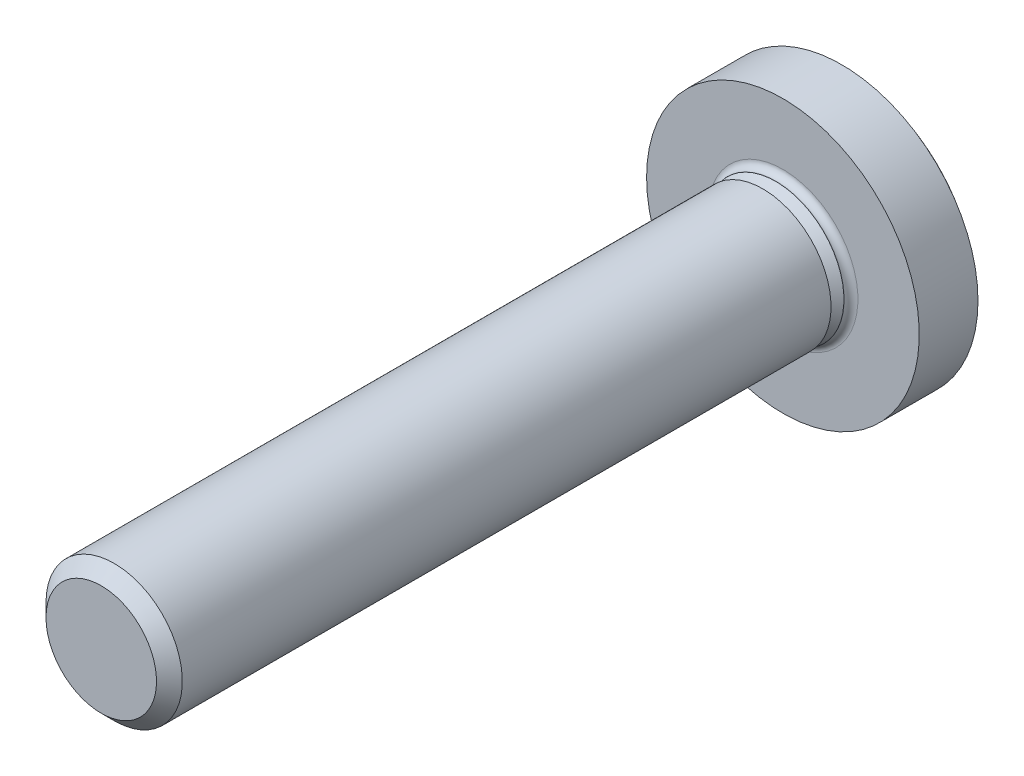
ISO-10303-21;
HEADER;
FILE_DESCRIPTION(('STEP AP214'),'2;1');
FILE_NAME('part.step','',(''),(''),'','','');
FILE_SCHEMA(('AUTOMOTIVE_DESIGN { 1 0 10303 214 1 1 1 1 }'));
ENDSEC;
DATA;
#1=APPLICATION_CONTEXT('core data for automotive mechanical design processes');
#2=APPLICATION_PROTOCOL_DEFINITION('international standard','automotive_design',2000,#1);
#3=PRODUCT_CONTEXT('',#1,'mechanical');
#4=PRODUCT('Part','Part','',(#3));
#5=PRODUCT_RELATED_PRODUCT_CATEGORY('part','',(#4));
#6=PRODUCT_DEFINITION_FORMATION('','',#4);
#7=PRODUCT_DEFINITION_CONTEXT('part definition',#1,'design');
#8=PRODUCT_DEFINITION('design','',#6,#7);
#9=PRODUCT_DEFINITION_SHAPE('','',#8);
#10=(LENGTH_UNIT() NAMED_UNIT(*) SI_UNIT(.MILLI.,.METRE.));
#11=(NAMED_UNIT(*) PLANE_ANGLE_UNIT() SI_UNIT($,.RADIAN.));
#12=(NAMED_UNIT(*) SI_UNIT($,.STERADIAN.) SOLID_ANGLE_UNIT());
#13=UNCERTAINTY_MEASURE_WITH_UNIT(LENGTH_MEASURE(1.E-05),#10,'distance_accuracy_value','');
#14=(GEOMETRIC_REPRESENTATION_CONTEXT(3) GLOBAL_UNCERTAINTY_ASSIGNED_CONTEXT((#13)) GLOBAL_UNIT_ASSIGNED_CONTEXT((#10,
#11,#12)) REPRESENTATION_CONTEXT('',''));
#15=CARTESIAN_POINT('',(0.,0.,0.));
#16=DIRECTION('',(0.,0.,1.));
#17=DIRECTION('',(1.,0.,0.));
#18=AXIS2_PLACEMENT_3D('',#15,#16,#17);
#19=CARTESIAN_POINT('',(0.,0.,6.5));
#20=DIRECTION('',(0.,0.,-1.));
#21=DIRECTION('',(0.,1.,0.));
#22=AXIS2_PLACEMENT_3D('',#19,#20,#21);
#23=SPHERICAL_SURFACE('',#22,6.5);
#24=CARTESIAN_POINT('',(0.,0.,1.3765246170202));
#25=DIRECTION('',(0.,0.,-1.));
#26=DIRECTION('',(-1.,0.,0.));
#27=AXIS2_PLACEMENT_3D('',#24,#25,#26);
#28=CIRCLE('',#27,4.);
#29=CARTESIAN_POINT('',(-4.,0.,1.3765246170202));
#30=VERTEX_POINT('',#29);
#31=EDGE_CURVE('E160',#30,#30,#28,.T.);
#32=ORIENTED_EDGE('',*,*,#31,.T.);
#33=EDGE_LOOP('',(#32));
#34=FACE_BOUND('',#33,.T.);
#35=CARTESIAN_POINT('',(-0.405545392562274,0.189108922281263,6.3801008200685));
#36=DIRECTION('',(-0.875426098065593,0.408217893676735,-0.258819045102521));
#37=DIRECTION('',(-0.422618261740699,-0.90630778703665,0.));
#38=AXIS2_PLACEMENT_3D('',#35,#36,#37);
#39=CIRCLE('',#38,6.48347090197349);
#40=CARTESIAN_POINT('',(0.92299563807694,-0.92299563807694,0.132413478861721));
#41=VERTEX_POINT('',#40);
#42=CARTESIAN_POINT('',(0.305622674506346,-2.10418012593627,0.35760463838069));
#43=VERTEX_POINT('',#42);
#44=EDGE_CURVE('E9',#41,#43,#39,.T.);
#45=ORIENTED_EDGE('',*,*,#44,.F.);
#46=CARTESIAN_POINT('',(-0.189108922281263,0.405545392562274,6.3801008200685));
#47=DIRECTION('',(-0.408217893676735,0.875426098065593,-0.258819045102521));
#48=DIRECTION('',(-0.90630778703665,-0.422618261740699,0.));
#49=AXIS2_PLACEMENT_3D('',#46,#47,#48);
#50=CIRCLE('',#49,6.48347090197349);
#51=CARTESIAN_POINT('',(2.10418012593627,-0.305622674506346,0.357604638380691));
#52=VERTEX_POINT('',#51);
#53=EDGE_CURVE('E24',#52,#41,#50,.T.);
#54=ORIENTED_EDGE('',*,*,#53,.F.);
#55=CARTESIAN_POINT('',(0.427627944162883,0.,6.61458256229943));
#56=DIRECTION('',(-0.965925826289068,0.,-0.258819045102521));
#57=DIRECTION('',(-0.258819045102521,0.,0.965925826289068));
#58=AXIS2_PLACEMENT_3D('',#55,#56,#57);
#59=CIRCLE('',#58,6.48490594980281);
#60=CARTESIAN_POINT('',(2.10418012593627,0.305622674506346,0.357604638380691));
#61=VERTEX_POINT('',#60);
#62=EDGE_CURVE('E224',#61,#52,#59,.T.);
#63=ORIENTED_EDGE('',*,*,#62,.F.);
#64=CARTESIAN_POINT('',(-0.189108922281263,-0.405545392562275,6.3801008200685));
#65=DIRECTION('',(-0.408217893676735,-0.875426098065593,-0.258819045102521));
#66=DIRECTION('',(0.90630778703665,-0.422618261740699,0.));
#67=AXIS2_PLACEMENT_3D('',#64,#65,#66);
#68=CIRCLE('',#67,6.48347090197349);
#69=CARTESIAN_POINT('',(0.922995638076941,0.922995638076939,0.132413478861721));
#70=VERTEX_POINT('',#69);
#71=EDGE_CURVE('E221',#70,#61,#68,.T.);
#72=ORIENTED_EDGE('',*,*,#71,.F.);
#73=CARTESIAN_POINT('',(-0.405545392562273,-0.189108922281263,6.3801008200685));
#74=DIRECTION('',(-0.875426098065593,-0.408217893676735,-0.258819045102521));
#75=DIRECTION('',(0.422618261740699,-0.90630778703665,0.));
#76=AXIS2_PLACEMENT_3D('',#73,#74,#75);
#77=CIRCLE('',#76,6.48347090197349);
#78=CARTESIAN_POINT('',(0.305622674506346,2.10418012593627,0.35760463838069));
#79=VERTEX_POINT('',#78);
#80=EDGE_CURVE('E218',#79,#70,#77,.T.);
#81=ORIENTED_EDGE('',*,*,#80,.F.);
#82=CARTESIAN_POINT('',(0.,0.427627944162883,6.61458256229943));
#83=DIRECTION('',(0.,-0.965925826289068,-0.258819045102521));
#84=DIRECTION('',(0.,0.258819045102521,-0.965925826289068));
#85=AXIS2_PLACEMENT_3D('',#82,#83,#84);
#86=CIRCLE('',#85,6.48490594980281);
#87=CARTESIAN_POINT('',(-0.305622674506345,2.10418012593627,0.35760463838069));
#88=VERTEX_POINT('',#87);
#89=EDGE_CURVE('E215',#88,#79,#86,.T.);
#90=ORIENTED_EDGE('',*,*,#89,.F.);
#91=CARTESIAN_POINT('',(0.405545392562275,-0.189108922281263,6.3801008200685));
#92=DIRECTION('',(0.875426098065593,-0.408217893676735,-0.258819045102521));
#93=DIRECTION('',(0.422618261740699,0.90630778703665,0.));
#94=AXIS2_PLACEMENT_3D('',#91,#92,#93);
#95=CIRCLE('',#94,6.48347090197349);
#96=CARTESIAN_POINT('',(-0.92299563807694,0.922995638076941,0.132413478861721));
#97=VERTEX_POINT('',#96);
#98=EDGE_CURVE('E212',#97,#88,#95,.T.);
#99=ORIENTED_EDGE('',*,*,#98,.F.);
#100=CARTESIAN_POINT('',(0.189108922281263,-0.405545392562273,6.3801008200685));
#101=DIRECTION('',(0.408217893676735,-0.875426098065593,-0.258819045102521));
#102=DIRECTION('',(0.90630778703665,0.422618261740699,0.));
#103=AXIS2_PLACEMENT_3D('',#100,#101,#102);
#104=CIRCLE('',#103,6.48347090197349);
#105=CARTESIAN_POINT('',(-2.10418012593627,0.305622674506346,0.35760463838069));
#106=VERTEX_POINT('',#105);
#107=EDGE_CURVE('E209',#106,#97,#104,.T.);
#108=ORIENTED_EDGE('',*,*,#107,.F.);
#109=CARTESIAN_POINT('',(-0.427627944162883,0.,6.61458256229943));
#110=DIRECTION('',(0.965925826289068,0.,-0.258819045102521));
#111=DIRECTION('',(-0.258819045102521,0.,-0.965925826289068));
#112=AXIS2_PLACEMENT_3D('',#109,#110,#111);
#113=CIRCLE('',#112,6.48490594980281);
#114=CARTESIAN_POINT('',(-2.10418012593627,-0.305622674506345,0.357604638380691));
#115=VERTEX_POINT('',#114);
#116=EDGE_CURVE('E206',#115,#106,#113,.T.);
#117=ORIENTED_EDGE('',*,*,#116,.F.);
#118=CARTESIAN_POINT('',(0.189108922281264,0.405545392562274,6.3801008200685));
#119=DIRECTION('',(0.408217893676735,0.875426098065593,-0.258819045102521));
#120=DIRECTION('',(-0.90630778703665,0.422618261740699,0.));
#121=AXIS2_PLACEMENT_3D('',#118,#119,#120);
#122=CIRCLE('',#121,6.48347090197349);
#123=CARTESIAN_POINT('',(-0.922995638076941,-0.92299563807694,0.132413478861721));
#124=VERTEX_POINT('',#123);
#125=EDGE_CURVE('E203',#124,#115,#122,.T.);
#126=ORIENTED_EDGE('',*,*,#125,.F.);
#127=CARTESIAN_POINT('',(0.405545392562273,0.189108922281263,6.3801008200685));
#128=DIRECTION('',(0.875426098065593,0.408217893676735,-0.258819045102521));
#129=DIRECTION('',(-0.422618261740699,0.90630778703665,0.));
#130=AXIS2_PLACEMENT_3D('',#127,#128,#129);
#131=CIRCLE('',#130,6.48347090197349);
#132=CARTESIAN_POINT('',(-0.305622674506346,-2.10418012593627,0.357604638380691));
#133=VERTEX_POINT('',#132);
#134=EDGE_CURVE('E200',#133,#124,#131,.T.);
#135=ORIENTED_EDGE('',*,*,#134,.F.);
#136=CARTESIAN_POINT('',(0.,-0.427627944162883,6.61458256229943));
#137=DIRECTION('',(0.,0.965925826289068,-0.258819045102521));
#138=DIRECTION('',(0.,0.258819045102521,0.965925826289068));
#139=AXIS2_PLACEMENT_3D('',#136,#137,#138);
#140=CIRCLE('',#139,6.48490594980281);
#141=EDGE_CURVE('E197',#43,#133,#140,.T.);
#142=ORIENTED_EDGE('',*,*,#141,.F.);
#143=EDGE_LOOP('',(#45,#54,#63,#72,#81,#90,#99,#108,#117,#126,#135,#142));
#144=FACE_BOUND('',#143,.T.);
#145=ADVANCED_FACE('F15',(#34,#144),#23,.T.);
#146=CARTESIAN_POINT('',(0.,0.,23.1));
#147=DIRECTION('',(0.,0.,-1.));
#148=DIRECTION('',(-1.,0.,0.));
#149=AXIS2_PLACEMENT_3D('',#146,#147,#148);
#150=PLANE('',#149);
#151=CARTESIAN_POINT('',(0.,0.,23.1));
#152=DIRECTION('',(0.,0.,-1.));
#153=DIRECTION('',(-1.,0.,0.));
#154=AXIS2_PLACEMENT_3D('',#151,#152,#153);
#155=CIRCLE('',#154,1.621125);
#156=CARTESIAN_POINT('',(-1.621125,0.,23.1));
#157=VERTEX_POINT('',#156);
#158=EDGE_CURVE('E193',#157,#157,#155,.T.);
#159=ORIENTED_EDGE('',*,*,#158,.F.);
#160=EDGE_LOOP('',(#159));
#161=FACE_BOUND('',#160,.T.);
#162=ADVANCED_FACE('F17',(#161),#150,.F.);
#163=CARTESIAN_POINT('',(0.,0.,23.1));
#164=DIRECTION('',(0.,0.,-1.));
#165=DIRECTION('',(-1.,0.,0.));
#166=AXIS2_PLACEMENT_3D('',#163,#164,#165);
#167=CONICAL_SURFACE('',#166,1.621125,0.785398163397448);
#168=CARTESIAN_POINT('',(0.,0.,22.721125));
#169=DIRECTION('',(0.,0.,-1.));
#170=DIRECTION('',(-1.,0.,0.));
#171=AXIS2_PLACEMENT_3D('',#168,#169,#170);
#172=CIRCLE('',#171,2.);
#173=CARTESIAN_POINT('',(-2.,0.,22.721125));
#174=VERTEX_POINT('',#173);
#175=EDGE_CURVE('E189',#174,#174,#172,.T.);
#176=ORIENTED_EDGE('',*,*,#175,.F.);
#177=EDGE_LOOP('',(#176));
#178=FACE_BOUND('',#177,.T.);
#179=ORIENTED_EDGE('',*,*,#158,.T.);
#180=EDGE_LOOP('',(#179));
#181=FACE_BOUND('',#180,.T.);
#182=ADVANCED_FACE('F245',(#178,#181),#167,.T.);
#183=CARTESIAN_POINT('',(0.,0.,0.));
#184=DIRECTION('',(0.,0.,-1.));
#185=DIRECTION('',(-1.,0.,0.));
#186=AXIS2_PLACEMENT_3D('',#183,#184,#185);
#187=CYLINDRICAL_SURFACE('',#186,2.);
#188=CARTESIAN_POINT('',(0.,0.,3.688875));
#189=DIRECTION('',(0.,0.,-1.));
#190=DIRECTION('',(-1.,0.,0.));
#191=AXIS2_PLACEMENT_3D('',#188,#189,#190);
#192=CIRCLE('',#191,2.);
#193=CARTESIAN_POINT('',(-2.,0.,3.688875));
#194=VERTEX_POINT('',#193);
#195=EDGE_CURVE('E185',#194,#194,#192,.T.);
#196=ORIENTED_EDGE('',*,*,#195,.F.);
#197=EDGE_LOOP('',(#196));
#198=FACE_BOUND('',#197,.T.);
#199=ORIENTED_EDGE('',*,*,#175,.T.);
#200=EDGE_LOOP('',(#199));
#201=FACE_BOUND('',#200,.T.);
#202=ADVANCED_FACE('F256',(#198,#201),#187,.T.);
#203=CARTESIAN_POINT('',(0.,2.,3.688875));
#204=DIRECTION('',(0.,0.,1.));
#205=DIRECTION('',(1.,0.,0.));
#206=AXIS2_PLACEMENT_3D('',#203,#204,#205);
#207=PLANE('',#206);
#208=CARTESIAN_POINT('',(0.,0.,3.688875));
#209=DIRECTION('',(0.,0.,-1.));
#210=DIRECTION('',(-1.,0.,0.));
#211=AXIS2_PLACEMENT_3D('',#208,#209,#210);
#212=CIRCLE('',#211,1.621125);
#213=CARTESIAN_POINT('',(-1.621125,0.,3.688875));
#214=VERTEX_POINT('',#213);
#215=EDGE_CURVE('E181',#214,#214,#212,.T.);
#216=ORIENTED_EDGE('',*,*,#215,.F.);
#217=EDGE_LOOP('',(#216));
#218=FACE_BOUND('',#217,.T.);
#219=ORIENTED_EDGE('',*,*,#195,.T.);
#220=EDGE_LOOP('',(#219));
#221=FACE_BOUND('',#220,.T.);
#222=ADVANCED_FACE('F265',(#218,#221),#207,.F.);
#223=CARTESIAN_POINT('',(0.,0.,3.688875));
#224=DIRECTION('',(0.,0.,-1.));
#225=DIRECTION('',(-1.,0.,0.));
#226=AXIS2_PLACEMENT_3D('',#223,#224,#225);
#227=CONICAL_SURFACE('',#226,1.621125,0.785398163397449);
#228=CARTESIAN_POINT('',(0.,0.,3.31));
#229=DIRECTION('',(0.,0.,-1.));
#230=DIRECTION('',(-1.,0.,0.));
#231=AXIS2_PLACEMENT_3D('',#228,#229,#230);
#232=CIRCLE('',#231,2.);
#233=CARTESIAN_POINT('',(-2.,0.,3.31));
#234=VERTEX_POINT('',#233);
#235=EDGE_CURVE('E177',#234,#234,#232,.T.);
#236=ORIENTED_EDGE('',*,*,#235,.F.);
#237=EDGE_LOOP('',(#236));
#238=FACE_BOUND('',#237,.T.);
#239=ORIENTED_EDGE('',*,*,#215,.T.);
#240=EDGE_LOOP('',(#239));
#241=FACE_BOUND('',#240,.T.);
#242=ADVANCED_FACE('F275',(#238,#241),#227,.T.);
#243=CARTESIAN_POINT('',(0.,0.,0.));
#244=DIRECTION('',(0.,0.,-1.));
#245=DIRECTION('',(-1.,0.,0.));
#246=AXIS2_PLACEMENT_3D('',#243,#244,#245);
#247=CYLINDRICAL_SURFACE('',#246,2.);
#248=CARTESIAN_POINT('',(0.,0.,3.3));
#249=DIRECTION('',(0.,0.,-1.));
#250=DIRECTION('',(-1.,0.,0.));
#251=AXIS2_PLACEMENT_3D('',#248,#249,#250);
#252=CIRCLE('',#251,2.);
#253=CARTESIAN_POINT('',(-2.,0.,3.3));
#254=VERTEX_POINT('',#253);
#255=EDGE_CURVE('E173',#254,#254,#252,.T.);
#256=ORIENTED_EDGE('',*,*,#255,.F.);
#257=EDGE_LOOP('',(#256));
#258=FACE_BOUND('',#257,.T.);
#259=ORIENTED_EDGE('',*,*,#235,.T.);
#260=EDGE_LOOP('',(#259));
#261=FACE_BOUND('',#260,.T.);
#262=ADVANCED_FACE('F285',(#258,#261),#247,.T.);
#263=CARTESIAN_POINT('',(0.,0.,3.3));
#264=DIRECTION('',(0.,0.,-1.));
#265=DIRECTION('',(-1.,0.,0.));
#266=AXIS2_PLACEMENT_3D('',#263,#264,#265);
#267=TOROIDAL_SURFACE('',#266,2.2,0.2);
#268=ORIENTED_EDGE('',*,*,#255,.T.);
#269=EDGE_LOOP('',(#268));
#270=FACE_BOUND('',#269,.T.);
#271=CARTESIAN_POINT('',(0.,0.,3.1));
#272=DIRECTION('',(0.,0.,-1.));
#273=DIRECTION('',(-1.,0.,0.));
#274=AXIS2_PLACEMENT_3D('',#271,#272,#273);
#275=CIRCLE('',#274,2.2);
#276=CARTESIAN_POINT('',(-2.2,0.,3.1));
#277=VERTEX_POINT('',#276);
#278=EDGE_CURVE('E169',#277,#277,#275,.T.);
#279=ORIENTED_EDGE('',*,*,#278,.F.);
#280=EDGE_LOOP('',(#279));
#281=FACE_BOUND('',#280,.T.);
#282=ADVANCED_FACE('F295',(#270,#281),#267,.F.);
#283=CARTESIAN_POINT('',(0.,2.2,3.1));
#284=DIRECTION('',(0.,0.,-1.));
#285=DIRECTION('',(-1.,0.,0.));
#286=AXIS2_PLACEMENT_3D('',#283,#284,#285);
#287=PLANE('',#286);
#288=CARTESIAN_POINT('',(0.,0.,3.1));
#289=DIRECTION('',(0.,0.,-1.));
#290=DIRECTION('',(-1.,0.,0.));
#291=AXIS2_PLACEMENT_3D('',#288,#289,#290);
#292=CIRCLE('',#291,4.);
#293=CARTESIAN_POINT('',(-4.,0.,3.1));
#294=VERTEX_POINT('',#293);
#295=EDGE_CURVE('E164',#294,#294,#292,.T.);
#296=ORIENTED_EDGE('',*,*,#295,.F.);
#297=EDGE_LOOP('',(#296));
#298=FACE_BOUND('',#297,.T.);
#299=ORIENTED_EDGE('',*,*,#278,.T.);
#300=EDGE_LOOP('',(#299));
#301=FACE_BOUND('',#300,.T.);
#302=ADVANCED_FACE('F305',(#298,#301),#287,.F.);
#303=CARTESIAN_POINT('',(0.,0.,0.));
#304=DIRECTION('',(0.,0.,-1.));
#305=DIRECTION('',(-1.,0.,0.));
#306=AXIS2_PLACEMENT_3D('',#303,#304,#305);
#307=CYLINDRICAL_SURFACE('',#306,4.);
#308=ORIENTED_EDGE('',*,*,#31,.F.);
#309=EDGE_LOOP('',(#308));
#310=FACE_BOUND('',#309,.T.);
#311=ORIENTED_EDGE('',*,*,#295,.T.);
#312=EDGE_LOOP('',(#311));
#313=FACE_BOUND('',#312,.T.);
#314=ADVANCED_FACE('F315',(#310,#313),#307,.T.);
#315=CARTESIAN_POINT('',(0.366666666666667,-2.2,0.));
#316=DIRECTION('',(-0.875426098065593,0.408217893676735,-0.258819045102521));
#317=DIRECTION('',(-0.422618261740699,-0.90630778703665,0.));
#318=AXIS2_PLACEMENT_3D('',#315,#316,#317);
#319=PLANE('',#318);
#320=ORIENTED_EDGE('',*,*,#44,.T.);
#321=DIRECTION('',(0.162689201767992,-0.255370893567974,-0.953057149569945));
#322=VECTOR('',#321,1.);
#323=CARTESIAN_POINT('',(0.366666666666667,-2.2,0.));
#324=LINE('',#323,#322);
#325=CARTESIAN_POINT('',(0.0423319890466869,-1.69089653438087,1.9));
#326=VERTEX_POINT('',#325);
#327=EDGE_CURVE('E31',#326,#43,#324,.T.);
#328=ORIENTED_EDGE('',*,*,#327,.F.);
#329=DIRECTION('',(0.422618261740699,0.90630778703665,0.));
#330=VECTOR('',#329,1.);
#331=CARTESIAN_POINT('',(0.149047069992156,-1.46204530477057,1.9));
#332=LINE('',#331,#330);
#333=CARTESIAN_POINT('',(0.566600049829658,-0.566600049829659,1.9));
#334=VERTEX_POINT('',#333);
#335=EDGE_CURVE('E117',#326,#334,#332,.T.);
#336=ORIENTED_EDGE('',*,*,#335,.T.);
#337=DIRECTION('',(0.193899607686987,-0.193899607686987,-0.961668281829896));
#338=VECTOR('',#337,1.);
#339=CARTESIAN_POINT('',(0.974781670177971,-0.974781670177972,-0.12442553751102));
#340=LINE('',#339,#338);
#341=EDGE_CURVE('E165',#334,#41,#340,.T.);
#342=ORIENTED_EDGE('',*,*,#341,.T.);
#343=EDGE_LOOP('',(#320,#328,#336,#342));
#344=FACE_BOUND('',#343,.T.);
#345=ADVANCED_FACE('F116',(#344),#319,.T.);
#346=CARTESIAN_POINT('',(0.949693951922647,-0.949693951922649,0.));
#347=DIRECTION('',(-0.408217893676735,0.875426098065593,-0.258819045102521));
#348=DIRECTION('',(-0.90630778703665,-0.422618261740699,0.));
#349=AXIS2_PLACEMENT_3D('',#346,#347,#348);
#350=PLANE('',#349);
#351=ORIENTED_EDGE('',*,*,#53,.T.);
#352=ORIENTED_EDGE('',*,*,#341,.F.);
#353=DIRECTION('',(0.90630778703665,0.422618261740699,0.));
#354=VECTOR('',#353,1.);
#355=CARTESIAN_POINT('',(0.177234242228863,-0.748164307737616,1.9));
#356=LINE('',#355,#354);
#357=CARTESIAN_POINT('',(1.69089653438087,-0.0423319890466872,1.9));
#358=VERTEX_POINT('',#357);
#359=EDGE_CURVE('E124',#334,#358,#356,.T.);
#360=ORIENTED_EDGE('',*,*,#359,.T.);
#361=DIRECTION('',(0.255370893567974,-0.162689201767992,-0.953057149569945));
#362=VECTOR('',#361,1.);
#363=CARTESIAN_POINT('',(2.2,-0.366666666666667,0.));
#364=LINE('',#363,#362);
#365=EDGE_CURVE('E506',#358,#52,#364,.T.);
#366=ORIENTED_EDGE('',*,*,#365,.T.);
#367=EDGE_LOOP('',(#351,#352,#360,#366));
#368=FACE_BOUND('',#367,.T.);
#369=ADVANCED_FACE('F333',(#368),#350,.T.);
#370=CARTESIAN_POINT('',(2.2,-0.366666666666667,0.));
#371=DIRECTION('',(-0.965925826289068,0.,-0.258819045102521));
#372=DIRECTION('',(-0.258819045102521,0.,0.965925826289068));
#373=AXIS2_PLACEMENT_3D('',#370,#371,#372);
#374=PLANE('',#373);
#375=ORIENTED_EDGE('',*,*,#62,.T.);
#376=ORIENTED_EDGE('',*,*,#365,.F.);
#377=DIRECTION('',(0.,1.,0.));
#378=VECTOR('',#377,1.);
#379=CARTESIAN_POINT('',(1.69089653438087,-1.67720172645669,1.9));
#380=LINE('',#379,#378);
#381=CARTESIAN_POINT('',(1.69089653438087,0.0423319890466869,1.9));
#382=VERTEX_POINT('',#381);
#383=EDGE_CURVE('E131',#358,#382,#380,.T.);
#384=ORIENTED_EDGE('',*,*,#383,.T.);
#385=DIRECTION('',(0.255370893567974,0.162689201767992,-0.953057149569945));
#386=VECTOR('',#385,1.);
#387=CARTESIAN_POINT('',(2.2,0.366666666666667,0.));
#388=LINE('',#387,#386);
#389=EDGE_CURVE('E503',#382,#61,#388,.T.);
#390=ORIENTED_EDGE('',*,*,#389,.T.);
#391=EDGE_LOOP('',(#375,#376,#384,#390));
#392=FACE_BOUND('',#391,.T.);
#393=ADVANCED_FACE('F348',(#392),#374,.T.);
#394=CARTESIAN_POINT('',(2.2,0.366666666666667,0.));
#395=DIRECTION('',(-0.408217893676735,-0.875426098065593,-0.258819045102521));
#396=DIRECTION('',(0.90630778703665,-0.422618261740699,0.));
#397=AXIS2_PLACEMENT_3D('',#394,#395,#396);
#398=PLANE('',#397);
#399=ORIENTED_EDGE('',*,*,#71,.T.);
#400=ORIENTED_EDGE('',*,*,#389,.F.);
#401=DIRECTION('',(-0.90630778703665,0.422618261740699,0.));
#402=VECTOR('',#401,1.);
#403=CARTESIAN_POINT('',(1.46204530477057,0.149047069992157,1.9));
#404=LINE('',#403,#402);
#405=CARTESIAN_POINT('',(0.566600049829659,0.566600049829658,1.9));
#406=VERTEX_POINT('',#405);
#407=EDGE_CURVE('E137',#382,#406,#404,.T.);
#408=ORIENTED_EDGE('',*,*,#407,.T.);
#409=DIRECTION('',(0.193899607686987,0.193899607686987,-0.961668281829896));
#410=VECTOR('',#409,1.);
#411=CARTESIAN_POINT('',(0.974781670177972,0.97478167017797,-0.12442553751102));
#412=LINE('',#411,#410);
#413=EDGE_CURVE('E500',#406,#70,#412,.T.);
#414=ORIENTED_EDGE('',*,*,#413,.T.);
#415=EDGE_LOOP('',(#399,#400,#408,#414));
#416=FACE_BOUND('',#415,.T.);
#417=ADVANCED_FACE('F357',(#416),#398,.T.);
#418=CARTESIAN_POINT('',(0.949693951922649,0.949693951922647,0.));
#419=DIRECTION('',(-0.875426098065593,-0.408217893676735,-0.258819045102521));
#420=DIRECTION('',(0.422618261740699,-0.90630778703665,0.));
#421=AXIS2_PLACEMENT_3D('',#418,#419,#420);
#422=PLANE('',#421);
#423=ORIENTED_EDGE('',*,*,#80,.T.);
#424=ORIENTED_EDGE('',*,*,#413,.F.);
#425=DIRECTION('',(-0.422618261740699,0.90630778703665,0.));
#426=VECTOR('',#425,1.);
#427=CARTESIAN_POINT('',(1.43385813253386,-1.29324091039736,1.9));
#428=LINE('',#427,#426);
#429=CARTESIAN_POINT('',(0.0423319890466871,1.69089653438087,1.9));
#430=VERTEX_POINT('',#429);
#431=EDGE_CURVE('E140',#406,#430,#428,.T.);
#432=ORIENTED_EDGE('',*,*,#431,.T.);
#433=DIRECTION('',(0.162689201767992,0.255370893567974,-0.953057149569945));
#434=VECTOR('',#433,1.);
#435=CARTESIAN_POINT('',(0.366666666666667,2.2,0.));
#436=LINE('',#435,#434);
#437=EDGE_CURVE('E497',#430,#79,#436,.T.);
#438=ORIENTED_EDGE('',*,*,#437,.T.);
#439=EDGE_LOOP('',(#423,#424,#432,#438));
#440=FACE_BOUND('',#439,.T.);
#441=ADVANCED_FACE('F368',(#440),#422,.T.);
#442=CARTESIAN_POINT('',(0.366666666666667,2.2,0.));
#443=DIRECTION('',(0.,-0.965925826289068,-0.258819045102521));
#444=DIRECTION('',(0.,0.258819045102521,-0.965925826289068));
#445=AXIS2_PLACEMENT_3D('',#442,#443,#444);
#446=PLANE('',#445);
#447=ORIENTED_EDGE('',*,*,#89,.T.);
#448=ORIENTED_EDGE('',*,*,#437,.F.);
#449=DIRECTION('',(-1.,0.,0.));
#450=VECTOR('',#449,1.);
#451=CARTESIAN_POINT('',(0.610451505290122,1.69089653438087,1.9));
#452=LINE('',#451,#450);
#453=CARTESIAN_POINT('',(-0.0423319890466866,1.69089653438087,1.9));
#454=VERTEX_POINT('',#453);
#455=EDGE_CURVE('E143',#430,#454,#452,.T.);
#456=ORIENTED_EDGE('',*,*,#455,.T.);
#457=DIRECTION('',(-0.162689201767992,0.255370893567974,-0.953057149569945));
#458=VECTOR('',#457,1.);
#459=CARTESIAN_POINT('',(-0.366666666666667,2.2,0.));
#460=LINE('',#459,#458);
#461=EDGE_CURVE('E494',#454,#88,#460,.T.);
#462=ORIENTED_EDGE('',*,*,#461,.T.);
#463=EDGE_LOOP('',(#447,#448,#456,#462));
#464=FACE_BOUND('',#463,.T.);
#465=ADVANCED_FACE('F379',(#464),#446,.T.);
#466=CARTESIAN_POINT('',(-0.366666666666667,2.2,0.));
#467=DIRECTION('',(0.875426098065593,-0.408217893676735,-0.258819045102521));
#468=DIRECTION('',(0.422618261740699,0.90630778703665,0.));
#469=AXIS2_PLACEMENT_3D('',#466,#467,#468);
#470=PLANE('',#469);
#471=ORIENTED_EDGE('',*,*,#98,.T.);
#472=ORIENTED_EDGE('',*,*,#461,.F.);
#473=DIRECTION('',(-0.422618261740699,-0.90630778703665,0.));
#474=VECTOR('',#473,1.);
#475=CARTESIAN_POINT('',(-1.21579729115873,-0.825607926976247,1.9));
#476=LINE('',#475,#474);
#477=CARTESIAN_POINT('',(-0.566600049829658,0.56660004982966,1.9));
#478=VERTEX_POINT('',#477);
#479=EDGE_CURVE('E146',#454,#478,#476,.T.);
#480=ORIENTED_EDGE('',*,*,#479,.T.);
#481=DIRECTION('',(-0.193899607686987,0.193899607686987,-0.961668281829896));
#482=VECTOR('',#481,1.);
#483=CARTESIAN_POINT('',(-0.97478167017797,0.974781670177972,-0.12442553751102));
#484=LINE('',#483,#482);
#485=EDGE_CURVE('E491',#478,#97,#484,.T.);
#486=ORIENTED_EDGE('',*,*,#485,.T.);
#487=EDGE_LOOP('',(#471,#472,#480,#486));
#488=FACE_BOUND('',#487,.T.);
#489=ADVANCED_FACE('F390',(#488),#470,.T.);
#490=CARTESIAN_POINT('',(-0.949693951922647,0.949693951922649,0.));
#491=DIRECTION('',(0.408217893676735,-0.875426098065593,-0.258819045102521));
#492=DIRECTION('',(0.90630778703665,0.422618261740699,0.));
#493=AXIS2_PLACEMENT_3D('',#490,#491,#492);
#494=PLANE('',#493);
#495=ORIENTED_EDGE('',*,*,#107,.T.);
#496=ORIENTED_EDGE('',*,*,#485,.F.);
#497=DIRECTION('',(-0.90630778703665,-0.422618261740699,0.));
#498=VECTOR('',#497,1.);
#499=CARTESIAN_POINT('',(-0.459203135565461,0.616680053413271,1.9));
#500=LINE('',#499,#498);
#501=CARTESIAN_POINT('',(-1.69089653438087,0.0423319890466875,1.9));
#502=VERTEX_POINT('',#501);
#503=EDGE_CURVE('E149',#478,#502,#500,.T.);
#504=ORIENTED_EDGE('',*,*,#503,.T.);
#505=DIRECTION('',(-0.255370893567974,0.162689201767992,-0.953057149569945));
#506=VECTOR('',#505,1.);
#507=CARTESIAN_POINT('',(-2.2,0.366666666666668,0.));
#508=LINE('',#507,#506);
#509=EDGE_CURVE('E488',#502,#106,#508,.T.);
#510=ORIENTED_EDGE('',*,*,#509,.T.);
#511=EDGE_LOOP('',(#495,#496,#504,#510));
#512=FACE_BOUND('',#511,.T.);
#513=ADVANCED_FACE('F401',(#512),#494,.T.);
#514=CARTESIAN_POINT('',(-2.2,0.366666666666668,0.));
#515=DIRECTION('',(0.965925826289068,0.,-0.258819045102521));
#516=DIRECTION('',(-0.258819045102521,0.,-0.965925826289068));
#517=AXIS2_PLACEMENT_3D('',#514,#515,#516);
#518=PLANE('',#517);
#519=ORIENTED_EDGE('',*,*,#116,.T.);
#520=ORIENTED_EDGE('',*,*,#509,.F.);
#521=DIRECTION('',(0.,-1.,0.));
#522=VECTOR('',#521,1.);
#523=CARTESIAN_POINT('',(-1.69089653438087,-1.67720172645669,1.9));
#524=LINE('',#523,#522);
#525=CARTESIAN_POINT('',(-1.69089653438087,-0.0423319890466864,1.9));
#526=VERTEX_POINT('',#525);
#527=EDGE_CURVE('E152',#502,#526,#524,.T.);
#528=ORIENTED_EDGE('',*,*,#527,.T.);
#529=DIRECTION('',(-0.255370893567974,-0.162689201767992,-0.953057149569945));
#530=VECTOR('',#529,1.);
#531=CARTESIAN_POINT('',(-2.2,-0.366666666666667,0.));
#532=LINE('',#531,#530);
#533=EDGE_CURVE('E483',#526,#115,#532,.T.);
#534=ORIENTED_EDGE('',*,*,#533,.T.);
#535=EDGE_LOOP('',(#519,#520,#528,#534));
#536=FACE_BOUND('',#535,.T.);
#537=ADVANCED_FACE('F412',(#536),#518,.T.);
#538=CARTESIAN_POINT('',(-2.2,-0.366666666666667,0.));
#539=DIRECTION('',(0.408217893676735,0.875426098065593,-0.258819045102521));
#540=DIRECTION('',(-0.90630778703665,0.422618261740699,0.));
#541=AXIS2_PLACEMENT_3D('',#538,#539,#540);
#542=PLANE('',#541);
#543=ORIENTED_EDGE('',*,*,#125,.T.);
#544=ORIENTED_EDGE('',*,*,#533,.F.);
#545=DIRECTION('',(0.90630778703665,-0.422618261740699,0.));
#546=VECTOR('',#545,1.);
#547=CARTESIAN_POINT('',(0.825607926976246,-1.21579729115873,1.9));
#548=LINE('',#547,#546);
#549=CARTESIAN_POINT('',(-0.56660004982966,-0.566600049829658,1.9));
#550=VERTEX_POINT('',#549);
#551=EDGE_CURVE('E155',#526,#550,#548,.T.);
#552=ORIENTED_EDGE('',*,*,#551,.T.);
#553=DIRECTION('',(-0.193899607686987,-0.193899607686987,-0.961668281829896));
#554=VECTOR('',#553,1.);
#555=CARTESIAN_POINT('',(-0.974781670177972,-0.97478167017797,-0.12442553751102));
#556=LINE('',#555,#554);
#557=EDGE_CURVE('E480',#550,#124,#556,.T.);
#558=ORIENTED_EDGE('',*,*,#557,.T.);
#559=EDGE_LOOP('',(#543,#544,#552,#558));
#560=FACE_BOUND('',#559,.T.);
#561=ADVANCED_FACE('F423',(#560),#542,.T.);
#562=CARTESIAN_POINT('',(-0.949693951922649,-0.949693951922647,0.));
#563=DIRECTION('',(0.875426098065593,0.408217893676735,-0.258819045102521));
#564=DIRECTION('',(-0.422618261740699,0.90630778703665,0.));
#565=AXIS2_PLACEMENT_3D('',#562,#563,#564);
#566=PLANE('',#565);
#567=ORIENTED_EDGE('',*,*,#134,.T.);
#568=ORIENTED_EDGE('',*,*,#557,.F.);
#569=DIRECTION('',(0.422618261740699,-0.90630778703665,0.));
#570=VECTOR('',#569,1.);
#571=CARTESIAN_POINT('',(0.0690137713829782,-1.92967828819168,1.9));
#572=LINE('',#571,#570);
#573=CARTESIAN_POINT('',(-0.0423319890466871,-1.69089653438087,1.9));
#574=VERTEX_POINT('',#573);
#575=EDGE_CURVE('E112',#550,#574,#572,.T.);
#576=ORIENTED_EDGE('',*,*,#575,.T.);
#577=DIRECTION('',(-0.162689201767992,-0.255370893567974,-0.953057149569945));
#578=VECTOR('',#577,1.);
#579=CARTESIAN_POINT('',(-0.366666666666667,-2.2,0.));
#580=LINE('',#579,#578);
#581=EDGE_CURVE('E107',#574,#133,#580,.T.);
#582=ORIENTED_EDGE('',*,*,#581,.T.);
#583=EDGE_LOOP('',(#567,#568,#576,#582));
#584=FACE_BOUND('',#583,.T.);
#585=ADVANCED_FACE('F434',(#584),#566,.T.);
#586=CARTESIAN_POINT('',(-0.366666666666667,-2.2,0.));
#587=DIRECTION('',(0.,0.965925826289068,-0.258819045102521));
#588=DIRECTION('',(0.,0.258819045102521,0.965925826289068));
#589=AXIS2_PLACEMENT_3D('',#586,#587,#588);
#590=PLANE('',#589);
#591=ORIENTED_EDGE('',*,*,#141,.T.);
#592=ORIENTED_EDGE('',*,*,#581,.F.);
#593=DIRECTION('',(1.,0.,0.));
#594=VECTOR('',#593,1.);
#595=CARTESIAN_POINT('',(0.610451505290122,-1.69089653438087,1.9));
#596=LINE('',#595,#594);
#597=EDGE_CURVE('E104',#574,#326,#596,.T.);
#598=ORIENTED_EDGE('',*,*,#597,.T.);
#599=ORIENTED_EDGE('',*,*,#327,.T.);
#600=EDGE_LOOP('',(#591,#592,#598,#599));
#601=FACE_BOUND('',#600,.T.);
#602=ADVANCED_FACE('F105',(#601),#590,.T.);
#603=CARTESIAN_POINT('',(0.610451505290122,-1.67720172645669,1.9));
#604=DIRECTION('',(0.,0.,-1.));
#605=DIRECTION('',(-1.,0.,0.));
#606=AXIS2_PLACEMENT_3D('',#603,#604,#605);
#607=PLANE('',#606);
#608=ORIENTED_EDGE('',*,*,#335,.F.);
#609=ORIENTED_EDGE('',*,*,#597,.F.);
#610=ORIENTED_EDGE('',*,*,#575,.F.);
#611=ORIENTED_EDGE('',*,*,#551,.F.);
#612=ORIENTED_EDGE('',*,*,#527,.F.);
#613=ORIENTED_EDGE('',*,*,#503,.F.);
#614=ORIENTED_EDGE('',*,*,#479,.F.);
#615=ORIENTED_EDGE('',*,*,#455,.F.);
#616=ORIENTED_EDGE('',*,*,#431,.F.);
#617=ORIENTED_EDGE('',*,*,#407,.F.);
#618=ORIENTED_EDGE('',*,*,#383,.F.);
#619=ORIENTED_EDGE('',*,*,#359,.F.);
#620=EDGE_LOOP('',(#608,#609,#610,#611,#612,#613,#614,#615,#616,#617,#618,#619));
#621=FACE_BOUND('',#620,.T.);
#622=ADVANCED_FACE('F122',(#621),#607,.T.);
#623=CLOSED_SHELL('',(#145,#162,#182,#202,#222,#242,#262,#282,#302,#314,#345,#369,#393,#417,
#441,#465,#489,#513,#537,#561,#585,#602,#622));
#624=MANIFOLD_SOLID_BREP('B1',#623);
#625=ADVANCED_BREP_SHAPE_REPRESENTATION('',(#18,#624),#14);
#626=SHAPE_DEFINITION_REPRESENTATION(#9,#625);
ENDSEC;
END-ISO-10303-21;
